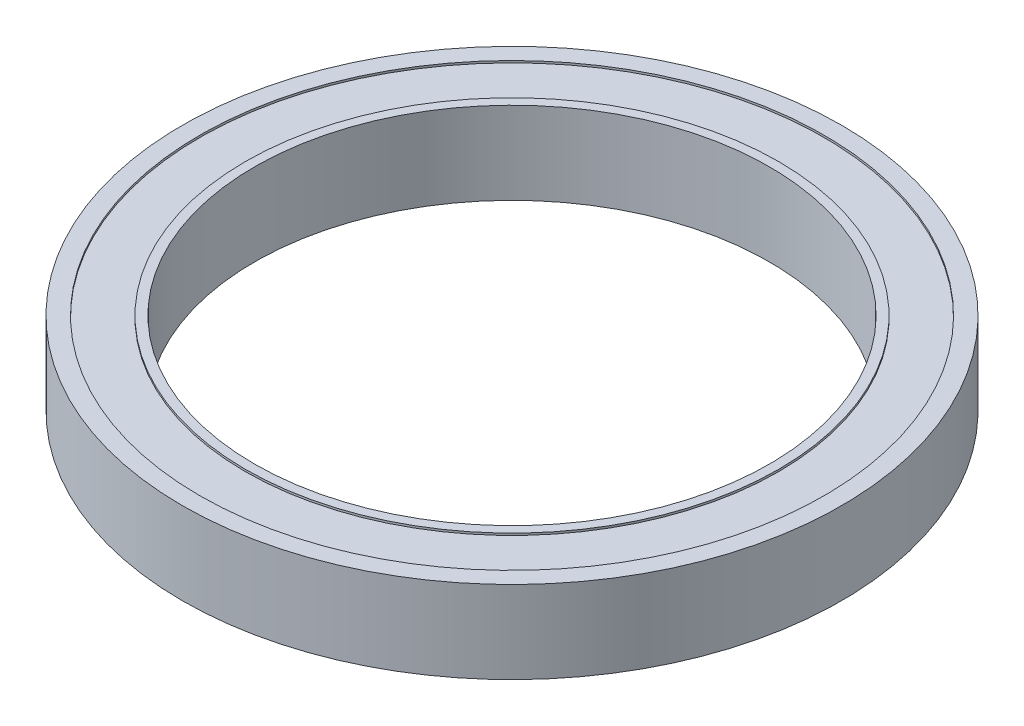
ISO-10303-21;
HEADER;
FILE_DESCRIPTION(('STEP AP214'),'2;1');
FILE_NAME('part.step','',(''),(''),'','','');
FILE_SCHEMA(('AUTOMOTIVE_DESIGN { 1 0 10303 214 1 1 1 1 }'));
ENDSEC;
DATA;
#1=APPLICATION_CONTEXT('core data for automotive mechanical design processes');
#2=APPLICATION_PROTOCOL_DEFINITION('international standard','automotive_design',2000,#1);
#3=PRODUCT_CONTEXT('',#1,'mechanical');
#4=PRODUCT('Part','Part','',(#3));
#5=PRODUCT_RELATED_PRODUCT_CATEGORY('part','',(#4));
#6=PRODUCT_DEFINITION_FORMATION('','',#4);
#7=PRODUCT_DEFINITION_CONTEXT('part definition',#1,'design');
#8=PRODUCT_DEFINITION('design','',#6,#7);
#9=PRODUCT_DEFINITION_SHAPE('','',#8);
#10=(LENGTH_UNIT() NAMED_UNIT(*) SI_UNIT(.MILLI.,.METRE.));
#11=(NAMED_UNIT(*) PLANE_ANGLE_UNIT() SI_UNIT($,.RADIAN.));
#12=(NAMED_UNIT(*) SI_UNIT($,.STERADIAN.) SOLID_ANGLE_UNIT());
#13=UNCERTAINTY_MEASURE_WITH_UNIT(LENGTH_MEASURE(1.E-05),#10,'distance_accuracy_value','');
#14=(GEOMETRIC_REPRESENTATION_CONTEXT(3) GLOBAL_UNCERTAINTY_ASSIGNED_CONTEXT((#13)) GLOBAL_UNIT_ASSIGNED_CONTEXT((#10,
#11,#12)) REPRESENTATION_CONTEXT('',''));
#15=CARTESIAN_POINT('',(0.,0.,0.));
#16=DIRECTION('',(0.,0.,1.));
#17=DIRECTION('',(1.,0.,0.));
#18=AXIS2_PLACEMENT_3D('',#15,#16,#17);
#19=CARTESIAN_POINT('',(0.,-2.,0.));
#20=DIRECTION('',(0.,1.,0.));
#21=DIRECTION('',(0.,0.,1.));
#22=AXIS2_PLACEMENT_3D('',#19,#20,#21);
#23=PLANE('',#22);
#24=CARTESIAN_POINT('',(0.,-2.,0.));
#25=DIRECTION('',(0.,1.,0.));
#26=DIRECTION('',(0.,0.,1.));
#27=AXIS2_PLACEMENT_3D('',#24,#25,#26);
#28=CIRCLE('',#27,12.5);
#29=CARTESIAN_POINT('',(0.,-2.,12.5));
#30=VERTEX_POINT('',#29);
#31=EDGE_CURVE('E51',#30,#30,#28,.T.);
#32=ORIENTED_EDGE('',*,*,#31,.T.);
#33=EDGE_LOOP('',(#32));
#34=FACE_BOUND('',#33,.T.);
#35=CARTESIAN_POINT('',(0.,-2.,0.));
#36=DIRECTION('',(0.,1.,0.));
#37=DIRECTION('',(0.,0.,1.));
#38=AXIS2_PLACEMENT_3D('',#35,#36,#37);
#39=CIRCLE('',#38,12.9432138861169);
#40=CARTESIAN_POINT('',(0.,-2.,12.9432138861169));
#41=VERTEX_POINT('',#40);
#42=EDGE_CURVE('E75',#41,#41,#39,.T.);
#43=ORIENTED_EDGE('',*,*,#42,.F.);
#44=EDGE_LOOP('',(#43));
#45=FACE_BOUND('',#44,.T.);
#46=ADVANCED_FACE('F38',(#34,#45),#23,.F.);
#47=CARTESIAN_POINT('',(0.,2.,0.));
#48=DIRECTION('',(0.,1.,0.));
#49=DIRECTION('',(0.,0.,1.));
#50=AXIS2_PLACEMENT_3D('',#47,#48,#49);
#51=PLANE('',#50);
#52=CARTESIAN_POINT('',(0.,2.,0.));
#53=DIRECTION('',(0.,1.,0.));
#54=DIRECTION('',(0.,0.,1.));
#55=AXIS2_PLACEMENT_3D('',#52,#53,#54);
#56=CIRCLE('',#55,12.5);
#57=CARTESIAN_POINT('',(0.,2.,12.5));
#58=VERTEX_POINT('',#57);
#59=EDGE_CURVE('E49',#58,#58,#56,.T.);
#60=ORIENTED_EDGE('',*,*,#59,.F.);
#61=EDGE_LOOP('',(#60));
#62=FACE_BOUND('',#61,.T.);
#63=CARTESIAN_POINT('',(0.,2.,0.));
#64=DIRECTION('',(0.,1.,0.));
#65=DIRECTION('',(0.,0.,1.));
#66=AXIS2_PLACEMENT_3D('',#63,#64,#65);
#67=CIRCLE('',#66,12.9432138861169);
#68=CARTESIAN_POINT('',(0.,2.,12.9432138861169));
#69=VERTEX_POINT('',#68);
#70=EDGE_CURVE('E63',#69,#69,#67,.T.);
#71=ORIENTED_EDGE('',*,*,#70,.T.);
#72=EDGE_LOOP('',(#71));
#73=FACE_BOUND('',#72,.T.);
#74=ADVANCED_FACE('F91',(#62,#73),#51,.T.);
#75=CARTESIAN_POINT('',(0.,2.,0.));
#76=DIRECTION('',(0.,1.,0.));
#77=DIRECTION('',(0.,0.,1.));
#78=AXIS2_PLACEMENT_3D('',#75,#76,#77);
#79=CIRCLE('',#78,15.1588416695978);
#80=CARTESIAN_POINT('',(0.,2.,15.1588416695978));
#81=VERTEX_POINT('',#80);
#82=EDGE_CURVE('E57',#81,#81,#79,.T.);
#83=ORIENTED_EDGE('',*,*,#82,.F.);
#84=EDGE_LOOP('',(#83));
#85=FACE_BOUND('',#84,.T.);
#86=CARTESIAN_POINT('',(0.,2.,0.));
#87=DIRECTION('',(0.,1.,0.));
#88=DIRECTION('',(0.,0.,1.));
#89=AXIS2_PLACEMENT_3D('',#86,#87,#88);
#90=CIRCLE('',#89,16.);
#91=CARTESIAN_POINT('',(0.,2.,16.));
#92=VERTEX_POINT('',#91);
#93=EDGE_CURVE('E10',#92,#92,#90,.T.);
#94=ORIENTED_EDGE('',*,*,#93,.T.);
#95=EDGE_LOOP('',(#94));
#96=FACE_BOUND('',#95,.T.);
#97=ADVANCED_FACE('F97',(#85,#96),#51,.T.);
#98=CARTESIAN_POINT('',(0.,-2.,0.));
#99=DIRECTION('',(0.,1.,0.));
#100=DIRECTION('',(0.,0.,1.));
#101=AXIS2_PLACEMENT_3D('',#98,#99,#100);
#102=CIRCLE('',#101,15.1588416695978);
#103=CARTESIAN_POINT('',(0.,-2.,15.1588416695978));
#104=VERTEX_POINT('',#103);
#105=EDGE_CURVE('E69',#104,#104,#102,.T.);
#106=ORIENTED_EDGE('',*,*,#105,.T.);
#107=EDGE_LOOP('',(#106));
#108=FACE_BOUND('',#107,.T.);
#109=CARTESIAN_POINT('',(0.,-2.,0.));
#110=DIRECTION('',(0.,1.,0.));
#111=DIRECTION('',(0.,0.,1.));
#112=AXIS2_PLACEMENT_3D('',#109,#110,#111);
#113=CIRCLE('',#112,16.);
#114=CARTESIAN_POINT('',(0.,-2.,16.));
#115=VERTEX_POINT('',#114);
#116=EDGE_CURVE('E42',#115,#115,#113,.T.);
#117=ORIENTED_EDGE('',*,*,#116,.F.);
#118=EDGE_LOOP('',(#117));
#119=FACE_BOUND('',#118,.T.);
#120=ADVANCED_FACE('F93',(#108,#119),#23,.F.);
#121=CARTESIAN_POINT('',(0.,2.,0.));
#122=DIRECTION('',(0.,-1.,0.));
#123=DIRECTION('',(0.,0.,-1.));
#124=AXIS2_PLACEMENT_3D('',#121,#122,#123);
#125=CYLINDRICAL_SURFACE('',#124,16.);
#126=ORIENTED_EDGE('',*,*,#93,.F.);
#127=EDGE_LOOP('',(#126));
#128=FACE_BOUND('',#127,.T.);
#129=ORIENTED_EDGE('',*,*,#116,.T.);
#130=EDGE_LOOP('',(#129));
#131=FACE_BOUND('',#130,.T.);
#132=ADVANCED_FACE('F40',(#128,#131),#125,.T.);
#133=CARTESIAN_POINT('',(0.,2.,0.));
#134=DIRECTION('',(0.,-1.,0.));
#135=DIRECTION('',(0.,0.,-1.));
#136=AXIS2_PLACEMENT_3D('',#133,#134,#135);
#137=CYLINDRICAL_SURFACE('',#136,12.5);
#138=ORIENTED_EDGE('',*,*,#59,.T.);
#139=EDGE_LOOP('',(#138));
#140=FACE_BOUND('',#139,.T.);
#141=ORIENTED_EDGE('',*,*,#31,.F.);
#142=EDGE_LOOP('',(#141));
#143=FACE_BOUND('',#142,.T.);
#144=ADVANCED_FACE('F106',(#140,#143),#137,.F.);
#145=CARTESIAN_POINT('',(0.,1.9,0.));
#146=DIRECTION('',(0.,1.,0.));
#147=DIRECTION('',(0.,0.,1.));
#148=AXIS2_PLACEMENT_3D('',#145,#146,#147);
#149=CYLINDRICAL_SURFACE('',#148,15.1588416695978);
#150=CARTESIAN_POINT('',(0.,1.9,0.));
#151=DIRECTION('',(0.,1.,0.));
#152=DIRECTION('',(0.,0.,1.));
#153=AXIS2_PLACEMENT_3D('',#150,#151,#152);
#154=CIRCLE('',#153,15.1588416695978);
#155=CARTESIAN_POINT('',(0.,1.9,15.1588416695978));
#156=VERTEX_POINT('',#155);
#157=EDGE_CURVE('E54',#156,#156,#154,.T.);
#158=ORIENTED_EDGE('',*,*,#157,.F.);
#159=EDGE_LOOP('',(#158));
#160=FACE_BOUND('',#159,.T.);
#161=ORIENTED_EDGE('',*,*,#82,.T.);
#162=EDGE_LOOP('',(#161));
#163=FACE_BOUND('',#162,.T.);
#164=ADVANCED_FACE('F130',(#160,#163),#149,.F.);
#165=CARTESIAN_POINT('',(0.,1.9,0.));
#166=DIRECTION('',(0.,1.,0.));
#167=DIRECTION('',(0.,0.,1.));
#168=AXIS2_PLACEMENT_3D('',#165,#166,#167);
#169=PLANE('',#168);
#170=CARTESIAN_POINT('',(0.,1.9,0.));
#171=DIRECTION('',(0.,1.,0.));
#172=DIRECTION('',(0.,0.,1.));
#173=AXIS2_PLACEMENT_3D('',#170,#171,#172);
#174=CIRCLE('',#173,12.9432138861169);
#175=CARTESIAN_POINT('',(0.,1.9,12.9432138861169));
#176=VERTEX_POINT('',#175);
#177=EDGE_CURVE('E60',#176,#176,#174,.T.);
#178=ORIENTED_EDGE('',*,*,#177,.F.);
#179=EDGE_LOOP('',(#178));
#180=FACE_BOUND('',#179,.T.);
#181=ORIENTED_EDGE('',*,*,#157,.T.);
#182=EDGE_LOOP('',(#181));
#183=FACE_BOUND('',#182,.T.);
#184=ADVANCED_FACE('F126',(#180,#183),#169,.T.);
#185=CARTESIAN_POINT('',(0.,1.9,0.));
#186=DIRECTION('',(0.,1.,0.));
#187=DIRECTION('',(0.,0.,1.));
#188=AXIS2_PLACEMENT_3D('',#185,#186,#187);
#189=CYLINDRICAL_SURFACE('',#188,12.9432138861169);
#190=ORIENTED_EDGE('',*,*,#177,.T.);
#191=EDGE_LOOP('',(#190));
#192=FACE_BOUND('',#191,.T.);
#193=ORIENTED_EDGE('',*,*,#70,.F.);
#194=EDGE_LOOP('',(#193));
#195=FACE_BOUND('',#194,.T.);
#196=ADVANCED_FACE('F120',(#192,#195),#189,.T.);
#197=CARTESIAN_POINT('',(0.,-1.9,0.));
#198=DIRECTION('',(0.,-1.,0.));
#199=DIRECTION('',(0.,0.,1.));
#200=AXIS2_PLACEMENT_3D('',#197,#198,#199);
#201=PLANE('',#200);
#202=CARTESIAN_POINT('',(0.,-1.9,0.));
#203=DIRECTION('',(0.,1.,0.));
#204=DIRECTION('',(0.,0.,1.));
#205=AXIS2_PLACEMENT_3D('',#202,#203,#204);
#206=CIRCLE('',#205,15.1588416695978);
#207=CARTESIAN_POINT('',(0.,-1.9,15.1588416695978));
#208=VERTEX_POINT('',#207);
#209=EDGE_CURVE('E66',#208,#208,#206,.T.);
#210=ORIENTED_EDGE('',*,*,#209,.F.);
#211=EDGE_LOOP('',(#210));
#212=FACE_BOUND('',#211,.T.);
#213=CARTESIAN_POINT('',(0.,-1.9,0.));
#214=DIRECTION('',(0.,1.,0.));
#215=DIRECTION('',(0.,0.,1.));
#216=AXIS2_PLACEMENT_3D('',#213,#214,#215);
#217=CIRCLE('',#216,12.9432138861169);
#218=CARTESIAN_POINT('',(0.,-1.9,12.9432138861169));
#219=VERTEX_POINT('',#218);
#220=EDGE_CURVE('E72',#219,#219,#217,.T.);
#221=ORIENTED_EDGE('',*,*,#220,.T.);
#222=EDGE_LOOP('',(#221));
#223=FACE_BOUND('',#222,.T.);
#224=ADVANCED_FACE('F81',(#212,#223),#201,.T.);
#225=CARTESIAN_POINT('',(0.,-1.9,0.));
#226=DIRECTION('',(0.,-1.,0.));
#227=DIRECTION('',(0.,0.,-1.));
#228=AXIS2_PLACEMENT_3D('',#225,#226,#227);
#229=CYLINDRICAL_SURFACE('',#228,15.1588416695978);
#230=ORIENTED_EDGE('',*,*,#209,.T.);
#231=EDGE_LOOP('',(#230));
#232=FACE_BOUND('',#231,.T.);
#233=ORIENTED_EDGE('',*,*,#105,.F.);
#234=EDGE_LOOP('',(#233));
#235=FACE_BOUND('',#234,.T.);
#236=ADVANCED_FACE('F86',(#232,#235),#229,.F.);
#237=CARTESIAN_POINT('',(0.,-1.9,0.));
#238=DIRECTION('',(0.,-1.,0.));
#239=DIRECTION('',(0.,0.,-1.));
#240=AXIS2_PLACEMENT_3D('',#237,#238,#239);
#241=CYLINDRICAL_SURFACE('',#240,12.9432138861169);
#242=ORIENTED_EDGE('',*,*,#220,.F.);
#243=EDGE_LOOP('',(#242));
#244=FACE_BOUND('',#243,.T.);
#245=ORIENTED_EDGE('',*,*,#42,.T.);
#246=EDGE_LOOP('',(#245));
#247=FACE_BOUND('',#246,.T.);
#248=ADVANCED_FACE('F83',(#244,#247),#241,.T.);
#249=CLOSED_SHELL('',(#46,#74,#97,#120,#132,#144,#164,#184,#196,#224,#236,#248));
#250=MANIFOLD_SOLID_BREP('B2',#249);
#251=ADVANCED_BREP_SHAPE_REPRESENTATION('',(#18,#250),#14);
#252=SHAPE_DEFINITION_REPRESENTATION(#9,#251);
ENDSEC;
END-ISO-10303-21;
